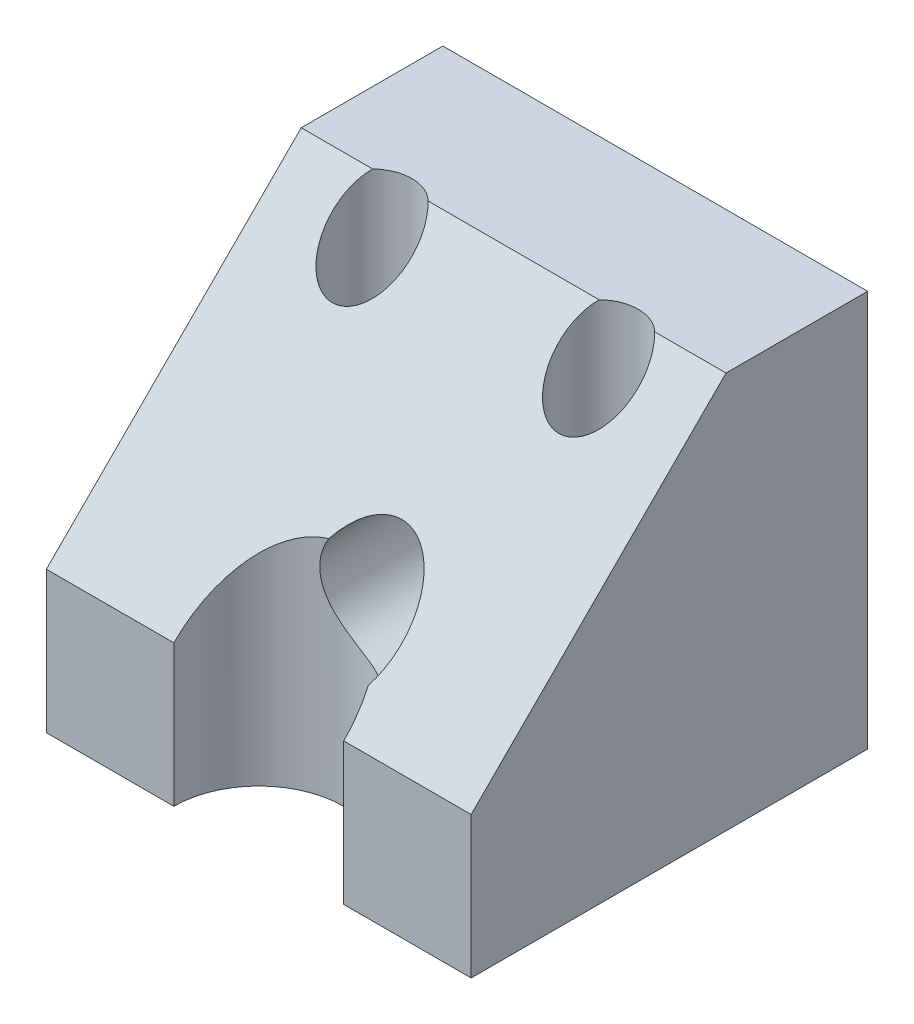
ISO-10303-21;
HEADER;
FILE_DESCRIPTION(('STEP AP214'),'2;1');
FILE_NAME('part.step','',(''),(''),'','','');
FILE_SCHEMA(('AUTOMOTIVE_DESIGN { 1 0 10303 214 1 1 1 1 }'));
ENDSEC;
DATA;
#1=APPLICATION_CONTEXT('core data for automotive mechanical design processes');
#2=APPLICATION_PROTOCOL_DEFINITION('international standard','automotive_design',2000,#1);
#3=PRODUCT_CONTEXT('',#1,'mechanical');
#4=PRODUCT('Part','Part','',(#3));
#5=PRODUCT_RELATED_PRODUCT_CATEGORY('part','',(#4));
#6=PRODUCT_DEFINITION_FORMATION('','',#4);
#7=PRODUCT_DEFINITION_CONTEXT('part definition',#1,'design');
#8=PRODUCT_DEFINITION('design','',#6,#7);
#9=PRODUCT_DEFINITION_SHAPE('','',#8);
#10=(LENGTH_UNIT() NAMED_UNIT(*) SI_UNIT(.MILLI.,.METRE.));
#11=(NAMED_UNIT(*) PLANE_ANGLE_UNIT() SI_UNIT($,.RADIAN.));
#12=(NAMED_UNIT(*) SI_UNIT($,.STERADIAN.) SOLID_ANGLE_UNIT());
#13=UNCERTAINTY_MEASURE_WITH_UNIT(LENGTH_MEASURE(1.E-05),#10,'distance_accuracy_value','');
#14=(GEOMETRIC_REPRESENTATION_CONTEXT(3) GLOBAL_UNCERTAINTY_ASSIGNED_CONTEXT((#13)) GLOBAL_UNIT_ASSIGNED_CONTEXT((#10,
#11,#12)) REPRESENTATION_CONTEXT('',''));
#15=CARTESIAN_POINT('',(0.,0.,0.));
#16=DIRECTION('',(0.,0.,1.));
#17=DIRECTION('',(1.,0.,0.));
#18=AXIS2_PLACEMENT_3D('',#15,#16,#17);
#19=CARTESIAN_POINT('',(15.,5.,14.));
#20=DIRECTION('',(0.,0.,-1.));
#21=DIRECTION('',(-1.,0.,0.));
#22=AXIS2_PLACEMENT_3D('',#19,#20,#21);
#23=PLANE('',#22);
#24=DIRECTION('',(-1.,0.,0.));
#25=VECTOR('',#24,1.);
#26=CARTESIAN_POINT('',(15.,5.,14.));
#27=LINE('',#26,#25);
#28=CARTESIAN_POINT('',(15.,5.,14.));
#29=VERTEX_POINT('',#28);
#30=CARTESIAN_POINT('',(10.5,5.,14.));
#31=VERTEX_POINT('',#30);
#32=EDGE_CURVE('E130',#29,#31,#27,.T.);
#33=ORIENTED_EDGE('',*,*,#32,.T.);
#34=DIRECTION('',(0.,-1.,0.));
#35=VECTOR('',#34,1.);
#36=CARTESIAN_POINT('',(10.5,14.,14.));
#37=LINE('',#36,#35);
#38=CARTESIAN_POINT('',(10.5,0.,14.));
#39=VERTEX_POINT('',#38);
#40=EDGE_CURVE('E117',#31,#39,#37,.T.);
#41=ORIENTED_EDGE('',*,*,#40,.T.);
#42=DIRECTION('',(-1.,0.,0.));
#43=VECTOR('',#42,1.);
#44=CARTESIAN_POINT('',(15.,0.,14.));
#45=LINE('',#44,#43);
#46=CARTESIAN_POINT('',(15.,0.,14.));
#47=VERTEX_POINT('',#46);
#48=EDGE_CURVE('E128',#47,#39,#45,.T.);
#49=ORIENTED_EDGE('',*,*,#48,.F.);
#50=DIRECTION('',(0.,-1.,0.));
#51=VECTOR('',#50,1.);
#52=CARTESIAN_POINT('',(15.,5.,14.));
#53=LINE('',#52,#51);
#54=EDGE_CURVE('E206',#29,#47,#53,.T.);
#55=ORIENTED_EDGE('',*,*,#54,.F.);
#56=EDGE_LOOP('',(#33,#41,#49,#55));
#57=FACE_BOUND('',#56,.T.);
#58=ADVANCED_FACE('F35',(#57),#23,.F.);
#59=CARTESIAN_POINT('',(4.5,0.,14.));
#60=VERTEX_POINT('',#59);
#61=CARTESIAN_POINT('',(0.,0.,14.));
#62=VERTEX_POINT('',#61);
#63=EDGE_CURVE('E138',#60,#62,#45,.T.);
#64=ORIENTED_EDGE('',*,*,#63,.F.);
#65=DIRECTION('',(0.,-1.,0.));
#66=VECTOR('',#65,1.);
#67=CARTESIAN_POINT('',(4.5,14.,14.));
#68=LINE('',#67,#66);
#69=CARTESIAN_POINT('',(4.5,5.,14.));
#70=VERTEX_POINT('',#69);
#71=EDGE_CURVE('E119',#60,#70,#68,.F.);
#72=ORIENTED_EDGE('',*,*,#71,.T.);
#73=CARTESIAN_POINT('',(0.,5.,14.));
#74=VERTEX_POINT('',#73);
#75=EDGE_CURVE('E209',#70,#74,#27,.T.);
#76=ORIENTED_EDGE('',*,*,#75,.T.);
#77=DIRECTION('',(0.,-1.,0.));
#78=VECTOR('',#77,1.);
#79=CARTESIAN_POINT('',(0.,5.,14.));
#80=LINE('',#79,#78);
#81=EDGE_CURVE('E185',#74,#62,#80,.T.);
#82=ORIENTED_EDGE('',*,*,#81,.T.);
#83=EDGE_LOOP('',(#64,#72,#76,#82));
#84=FACE_BOUND('',#83,.T.);
#85=ADVANCED_FACE('F37',(#84),#23,.F.);
#86=CARTESIAN_POINT('',(15.,0.,14.));
#87=DIRECTION('',(0.,1.,0.));
#88=DIRECTION('',(0.,0.,1.));
#89=AXIS2_PLACEMENT_3D('',#86,#87,#88);
#90=PLANE('',#89);
#91=CARTESIAN_POINT('',(3.5,0.,6.));
#92=DIRECTION('',(0.,1.,0.));
#93=DIRECTION('',(0.,0.,1.));
#94=AXIS2_PLACEMENT_3D('',#91,#92,#93);
#95=CIRCLE('',#94,1.4);
#96=CARTESIAN_POINT('',(3.5,0.,7.4));
#97=VERTEX_POINT('',#96);
#98=EDGE_CURVE('E240',#97,#97,#95,.T.);
#99=ORIENTED_EDGE('',*,*,#98,.T.);
#100=EDGE_LOOP('',(#99));
#101=FACE_BOUND('',#100,.T.);
#102=CARTESIAN_POINT('',(11.5,0.,6.));
#103=DIRECTION('',(0.,1.,0.));
#104=DIRECTION('',(0.,0.,1.));
#105=AXIS2_PLACEMENT_3D('',#102,#103,#104);
#106=CIRCLE('',#105,1.4);
#107=CARTESIAN_POINT('',(11.5,0.,7.4));
#108=VERTEX_POINT('',#107);
#109=EDGE_CURVE('E197',#108,#108,#106,.T.);
#110=ORIENTED_EDGE('',*,*,#109,.T.);
#111=EDGE_LOOP('',(#110));
#112=FACE_BOUND('',#111,.T.);
#113=ORIENTED_EDGE('',*,*,#48,.T.);
#114=CARTESIAN_POINT('',(7.5,0.,14.));
#115=DIRECTION('',(0.,-1.,0.));
#116=DIRECTION('',(0.,0.,-1.));
#117=AXIS2_PLACEMENT_3D('',#114,#115,#116);
#118=CIRCLE('',#117,3.);
#119=EDGE_CURVE('E114',#60,#39,#118,.T.);
#120=ORIENTED_EDGE('',*,*,#119,.F.);
#121=ORIENTED_EDGE('',*,*,#63,.T.);
#122=DIRECTION('',(0.,0.,-1.));
#123=VECTOR('',#122,1.);
#124=CARTESIAN_POINT('',(0.,0.,14.));
#125=LINE('',#124,#123);
#126=CARTESIAN_POINT('',(0.,0.,0.));
#127=VERTEX_POINT('',#126);
#128=EDGE_CURVE('E187',#62,#127,#125,.T.);
#129=ORIENTED_EDGE('',*,*,#128,.T.);
#130=DIRECTION('',(-1.,0.,0.));
#131=VECTOR('',#130,1.);
#132=CARTESIAN_POINT('',(15.,0.,0.));
#133=LINE('',#132,#131);
#134=CARTESIAN_POINT('',(15.,0.,0.));
#135=VERTEX_POINT('',#134);
#136=EDGE_CURVE('E142',#135,#127,#133,.T.);
#137=ORIENTED_EDGE('',*,*,#136,.F.);
#138=DIRECTION('',(0.,0.,-1.));
#139=VECTOR('',#138,1.);
#140=CARTESIAN_POINT('',(15.,0.,14.));
#141=LINE('',#140,#139);
#142=EDGE_CURVE('E135',#47,#135,#141,.T.);
#143=ORIENTED_EDGE('',*,*,#142,.F.);
#144=EDGE_LOOP('',(#113,#120,#121,#129,#137,#143));
#145=FACE_BOUND('',#144,.T.);
#146=ADVANCED_FACE('F133',(#101,#112,#145),#90,.F.);
#147=CARTESIAN_POINT('',(15.,0.,0.));
#148=DIRECTION('',(0.,0.,1.));
#149=DIRECTION('',(1.,0.,0.));
#150=AXIS2_PLACEMENT_3D('',#147,#148,#149);
#151=PLANE('',#150);
#152=CARTESIAN_POINT('',(8.65,7.,0.));
#153=DIRECTION('',(0.,0.,-1.));
#154=DIRECTION('',(-1.,0.,0.));
#155=AXIS2_PLACEMENT_3D('',#152,#153,#154);
#156=CIRCLE('',#155,1.9);
#157=CARTESIAN_POINT('',(6.75,7.,0.));
#158=VERTEX_POINT('',#157);
#159=EDGE_CURVE('E131',#158,#158,#156,.T.);
#160=ORIENTED_EDGE('',*,*,#159,.F.);
#161=EDGE_LOOP('',(#160));
#162=FACE_BOUND('',#161,.T.);
#163=DIRECTION('',(0.,1.,0.));
#164=VECTOR('',#163,1.);
#165=CARTESIAN_POINT('',(0.,0.,0.));
#166=LINE('',#165,#164);
#167=CARTESIAN_POINT('',(0.,14.,0.));
#168=VERTEX_POINT('',#167);
#169=EDGE_CURVE('E193',#127,#168,#166,.T.);
#170=ORIENTED_EDGE('',*,*,#169,.T.);
#171=DIRECTION('',(-1.,0.,0.));
#172=VECTOR('',#171,1.);
#173=CARTESIAN_POINT('',(15.,14.,0.));
#174=LINE('',#173,#172);
#175=CARTESIAN_POINT('',(15.,14.,0.));
#176=VERTEX_POINT('',#175);
#177=EDGE_CURVE('E212',#176,#168,#174,.T.);
#178=ORIENTED_EDGE('',*,*,#177,.F.);
#179=DIRECTION('',(0.,1.,0.));
#180=VECTOR('',#179,1.);
#181=CARTESIAN_POINT('',(15.,0.,0.));
#182=LINE('',#181,#180);
#183=EDGE_CURVE('E220',#135,#176,#182,.T.);
#184=ORIENTED_EDGE('',*,*,#183,.F.);
#185=ORIENTED_EDGE('',*,*,#136,.T.);
#186=EDGE_LOOP('',(#170,#178,#184,#185));
#187=FACE_BOUND('',#186,.T.);
#188=ADVANCED_FACE('F180',(#162,#187),#151,.F.);
#189=CARTESIAN_POINT('',(15.,14.,0.));
#190=DIRECTION('',(0.,-1.,0.));
#191=DIRECTION('',(0.,0.,-1.));
#192=AXIS2_PLACEMENT_3D('',#189,#190,#191);
#193=PLANE('',#192);
#194=DIRECTION('',(-1.,0.,0.));
#195=VECTOR('',#194,1.);
#196=CARTESIAN_POINT('',(15.,14.,5.00000000000004));
#197=LINE('',#196,#195);
#198=CARTESIAN_POINT('',(2.52020410288669,14.,5.00000000000004));
#199=VERTEX_POINT('',#198);
#200=CARTESIAN_POINT('',(0.,14.,5.00000000000004));
#201=VERTEX_POINT('',#200);
#202=EDGE_CURVE('E208',#199,#201,#197,.T.);
#203=ORIENTED_EDGE('',*,*,#202,.F.);
#204=CARTESIAN_POINT('',(3.5,14.,6.));
#205=DIRECTION('',(0.,-1.,0.));
#206=DIRECTION('',(0.,0.,-1.));
#207=AXIS2_PLACEMENT_3D('',#204,#205,#206);
#208=CIRCLE('',#207,1.4);
#209=CARTESIAN_POINT('',(4.47979589711331,14.,5.00000000000004));
#210=VERTEX_POINT('',#209);
#211=EDGE_CURVE('E61',#199,#210,#208,.T.);
#212=ORIENTED_EDGE('',*,*,#211,.T.);
#213=CARTESIAN_POINT('',(10.5202041028867,14.,5.00000000000004));
#214=VERTEX_POINT('',#213);
#215=EDGE_CURVE('E213',#214,#210,#197,.T.);
#216=ORIENTED_EDGE('',*,*,#215,.F.);
#217=CARTESIAN_POINT('',(11.5,14.,6.));
#218=DIRECTION('',(0.,-1.,0.));
#219=DIRECTION('',(0.,0.,-1.));
#220=AXIS2_PLACEMENT_3D('',#217,#218,#219);
#221=CIRCLE('',#220,1.4);
#222=CARTESIAN_POINT('',(12.4797958971133,14.,5.00000000000004));
#223=VERTEX_POINT('',#222);
#224=EDGE_CURVE('E238',#214,#223,#221,.T.);
#225=ORIENTED_EDGE('',*,*,#224,.T.);
#226=CARTESIAN_POINT('',(15.,14.,5.00000000000004));
#227=VERTEX_POINT('',#226);
#228=EDGE_CURVE('E210',#227,#223,#197,.T.);
#229=ORIENTED_EDGE('',*,*,#228,.F.);
#230=DIRECTION('',(0.,0.,1.));
#231=VECTOR('',#230,1.);
#232=CARTESIAN_POINT('',(15.,14.,0.));
#233=LINE('',#232,#231);
#234=EDGE_CURVE('E222',#176,#227,#233,.T.);
#235=ORIENTED_EDGE('',*,*,#234,.F.);
#236=ORIENTED_EDGE('',*,*,#177,.T.);
#237=DIRECTION('',(0.,0.,1.));
#238=VECTOR('',#237,1.);
#239=CARTESIAN_POINT('',(0.,14.,0.));
#240=LINE('',#239,#238);
#241=EDGE_CURVE('E195',#168,#201,#240,.T.);
#242=ORIENTED_EDGE('',*,*,#241,.T.);
#243=EDGE_LOOP('',(#203,#212,#216,#225,#229,#235,#236,#242));
#244=FACE_BOUND('',#243,.T.);
#245=ADVANCED_FACE('F233',(#244),#193,.F.);
#246=CARTESIAN_POINT('',(15.,14.,5.00000000000004));
#247=DIRECTION('',(0.,-0.707106781186546,-0.707106781186549));
#248=DIRECTION('',(0.,0.707106781186549,-0.707106781186546));
#249=AXIS2_PLACEMENT_3D('',#246,#247,#248);
#250=PLANE('',#249);
#251=ORIENTED_EDGE('',*,*,#75,.F.);
#252=CARTESIAN_POINT('',(7.5,5.,14.));
#253=DIRECTION('',(0.,-0.707106781186546,-0.707106781186549));
#254=DIRECTION('',(0.,-0.707106781186549,0.707106781186546));
#255=AXIS2_PLACEMENT_3D('',#252,#253,#254);
#256=ELLIPSE('',#255,4.24264068711929,3.);
#257=CARTESIAN_POINT('',(7.01021900340485,7.95974907304223,11.0402509269578));
#258=VERTEX_POINT('',#257);
#259=EDGE_CURVE('E253',#70,#258,#256,.T.);
#260=ORIENTED_EDGE('',*,*,#259,.T.);
#261=CARTESIAN_POINT('',(8.65,7.,12.));
#262=DIRECTION('',(0.,-0.707106781186546,-0.707106781186549));
#263=DIRECTION('',(0.,0.707106781186549,-0.707106781186546));
#264=AXIS2_PLACEMENT_3D('',#261,#262,#263);
#265=ELLIPSE('',#264,2.68700576850887,1.9);
#266=CARTESIAN_POINT('',(10.3043653084787,6.06561494762476,12.9343850523752));
#267=VERTEX_POINT('',#266);
#268=EDGE_CURVE('E151',#258,#267,#265,.T.);
#269=ORIENTED_EDGE('',*,*,#268,.T.);
#270=EDGE_CURVE('E55',#267,#31,#256,.T.);
#271=ORIENTED_EDGE('',*,*,#270,.T.);
#272=ORIENTED_EDGE('',*,*,#32,.F.);
#273=DIRECTION('',(0.,-0.707106781186549,0.707106781186546));
#274=VECTOR('',#273,1.);
#275=CARTESIAN_POINT('',(15.,14.,5.00000000000004));
#276=LINE('',#275,#274);
#277=EDGE_CURVE('E224',#227,#29,#276,.T.);
#278=ORIENTED_EDGE('',*,*,#277,.F.);
#279=ORIENTED_EDGE('',*,*,#228,.T.);
#280=CARTESIAN_POINT('',(11.5,13.,6.));
#281=DIRECTION('',(0.,-0.707106781186546,-0.707106781186549));
#282=DIRECTION('',(0.,-0.707106781186549,0.707106781186546));
#283=AXIS2_PLACEMENT_3D('',#280,#281,#282);
#284=ELLIPSE('',#283,1.97989898732234,1.4);
#285=EDGE_CURVE('E137',#223,#214,#284,.T.);
#286=ORIENTED_EDGE('',*,*,#285,.T.);
#287=ORIENTED_EDGE('',*,*,#215,.T.);
#288=CARTESIAN_POINT('',(3.5,13.,6.));
#289=DIRECTION('',(0.,-0.707106781186546,-0.707106781186549));
#290=DIRECTION('',(0.,-0.707106781186549,0.707106781186546));
#291=AXIS2_PLACEMENT_3D('',#288,#289,#290);
#292=ELLIPSE('',#291,1.97989898732234,1.4);
#293=EDGE_CURVE('E48',#210,#199,#292,.T.);
#294=ORIENTED_EDGE('',*,*,#293,.T.);
#295=ORIENTED_EDGE('',*,*,#202,.T.);
#296=DIRECTION('',(0.,-0.707106781186549,0.707106781186546));
#297=VECTOR('',#296,1.);
#298=CARTESIAN_POINT('',(0.,14.,5.00000000000004));
#299=LINE('',#298,#297);
#300=EDGE_CURVE('E203',#201,#74,#299,.T.);
#301=ORIENTED_EDGE('',*,*,#300,.T.);
#302=EDGE_LOOP('',(#251,#260,#269,#271,#272,#278,#279,#286,#287,#294,#295,#301));
#303=FACE_BOUND('',#302,.T.);
#304=ADVANCED_FACE('F231',(#303),#250,.F.);
#305=CARTESIAN_POINT('',(15.,0.,0.));
#306=DIRECTION('',(1.,0.,0.));
#307=DIRECTION('',(0.,0.,-1.));
#308=AXIS2_PLACEMENT_3D('',#305,#306,#307);
#309=PLANE('',#308);
#310=ORIENTED_EDGE('',*,*,#54,.T.);
#311=ORIENTED_EDGE('',*,*,#142,.T.);
#312=ORIENTED_EDGE('',*,*,#183,.T.);
#313=ORIENTED_EDGE('',*,*,#234,.T.);
#314=ORIENTED_EDGE('',*,*,#277,.T.);
#315=EDGE_LOOP('',(#310,#311,#312,#313,#314));
#316=FACE_BOUND('',#315,.T.);
#317=ADVANCED_FACE('F269',(#316),#309,.T.);
#318=CARTESIAN_POINT('',(0.,0.,0.));
#319=DIRECTION('',(1.,0.,0.));
#320=DIRECTION('',(0.,0.,-1.));
#321=AXIS2_PLACEMENT_3D('',#318,#319,#320);
#322=PLANE('',#321);
#323=ORIENTED_EDGE('',*,*,#81,.F.);
#324=ORIENTED_EDGE('',*,*,#300,.F.);
#325=ORIENTED_EDGE('',*,*,#241,.F.);
#326=ORIENTED_EDGE('',*,*,#169,.F.);
#327=ORIENTED_EDGE('',*,*,#128,.F.);
#328=EDGE_LOOP('',(#323,#324,#325,#326,#327));
#329=FACE_BOUND('',#328,.T.);
#330=ADVANCED_FACE('F168',(#329),#322,.F.);
#331=CARTESIAN_POINT('',(11.5,14.,6.));
#332=DIRECTION('',(0.,-1.,0.));
#333=DIRECTION('',(0.,0.,-1.));
#334=AXIS2_PLACEMENT_3D('',#331,#332,#333);
#335=CYLINDRICAL_SURFACE('',#334,1.4);
#336=CARTESIAN_POINT('',(10.1,8.22780291578086,6.));
#337=CARTESIAN_POINT('',(10.1000006261379,8.22780293299463,5.94769403627329));
#338=CARTESIAN_POINT('',(10.1029521152557,8.22434203738309,5.89538225364711));
#339=CARTESIAN_POINT('',(10.1145178510226,8.21048218725627,5.79232523663787));
#340=CARTESIAN_POINT('',(10.1231327541559,8.200082428409,5.74158018457903));
#341=CARTESIAN_POINT('',(10.1452934795097,8.1723521225977,5.64319241044657));
#342=CARTESIAN_POINT('',(10.1588362302078,8.15502589223418,5.59554777764411));
#343=CARTESIAN_POINT('',(10.1896800421642,8.11357467604412,5.50465555552102));
#344=CARTESIAN_POINT('',(10.2069805089393,8.08945076545371,5.46140727227036));
#345=CARTESIAN_POINT('',(10.2437253681816,8.03494387044842,5.38053421885084));
#346=CARTESIAN_POINT('',(10.2631561593972,8.00459962880053,5.34287701535966));
#347=CARTESIAN_POINT('',(10.302651107393,7.93820836571775,5.27339405598039));
#348=CARTESIAN_POINT('',(10.3227154008019,7.90216010726814,5.24156956825621));
#349=CARTESIAN_POINT('',(10.3634631936393,7.82231214064374,5.181649555582));
#350=CARTESIAN_POINT('',(10.384079345856,7.77813294539644,5.1540160034563));
#351=CARTESIAN_POINT('',(10.4228073271359,7.68533754230717,5.10522153618643));
#352=CARTESIAN_POINT('',(10.4409177677677,7.63671889910692,5.08406420174872));
#353=CARTESIAN_POINT('',(10.475857069044,7.52904046247975,5.04505735650586));
#354=CARTESIAN_POINT('',(10.4921382634751,7.46947863580732,5.02810490239202));
#355=CARTESIAN_POINT('',(10.5189814499641,7.34758347009422,5.00101833730363));
#356=CARTESIAN_POINT('',(10.5295399774365,7.2852484767912,4.99088835585446));
#357=CARTESIAN_POINT('',(10.5454859200758,7.14979874112037,4.97576989228112));
#358=CARTESIAN_POINT('',(10.5498762934442,7.07645439153695,4.97176467400321));
#359=CARTESIAN_POINT('',(10.5501187327985,6.9296947773853,4.97154354185673));
#360=CARTESIAN_POINT('',(10.5459638450453,6.85627950369362,4.97533397172687));
#361=CARTESIAN_POINT('',(10.5288008971303,6.70648692100985,4.99157221056953));
#362=CARTESIAN_POINT('',(10.5152298103124,6.63023134608836,5.00457176808361));
#363=CARTESIAN_POINT('',(10.4796918613551,6.4823263191408,5.04103295453408));
#364=CARTESIAN_POINT('',(10.4577355958376,6.41067118634841,5.06448138510461));
#365=CARTESIAN_POINT('',(10.413268309356,6.29002785701633,5.11687722441608));
#366=CARTESIAN_POINT('',(10.3919738471427,6.2395491568787,5.14343077485685));
#367=CARTESIAN_POINT('',(10.3473711212773,6.14462096355805,5.20446788347059));
#368=CARTESIAN_POINT('',(10.3240644208514,6.10016685789098,5.23894531989643));
#369=CARTESIAN_POINT('',(10.2775114705421,6.01845152340635,5.31621497037712));
#370=CARTESIAN_POINT('',(10.2542665310387,5.98123747251603,5.35905829914517));
#371=CARTESIAN_POINT('',(10.2105886224253,5.91550508946991,5.4522278517225));
#372=CARTESIAN_POINT('',(10.1901545860548,5.88698345189907,5.5025512202821));
#373=CARTESIAN_POINT('',(10.1565214700203,5.84194298762511,5.60307123164952));
#374=CARTESIAN_POINT('',(10.1427658777191,5.82443228081042,5.65264011045328));
#375=CARTESIAN_POINT('',(10.1206218326676,5.79684258125246,5.75494687648928));
#376=CARTESIAN_POINT('',(10.1122322103654,5.7867619689934,5.80768407042126));
#377=CARTESIAN_POINT('',(10.1018495030679,5.77435959654766,5.91183980258837));
#378=CARTESIAN_POINT('',(10.0995446613185,5.77165942025778,5.96318292876059));
#379=CARTESIAN_POINT('',(10.1006045715627,5.77291099839244,6.06572524142117));
#380=CARTESIAN_POINT('',(10.1039684596428,5.776861739218,6.11692444865165));
#381=CARTESIAN_POINT('',(10.1160527086539,5.7913742082501,6.2173177367348));
#382=CARTESIAN_POINT('',(10.1247316801734,5.80188486530898,6.26652420910961));
#383=CARTESIAN_POINT('',(10.1467155565819,5.82946544994806,6.36196590076857));
#384=CARTESIAN_POINT('',(10.16001992408,5.84653461556729,6.40820146448185));
#385=CARTESIAN_POINT('',(10.1902730549035,5.88725429084133,6.49681391193307));
#386=CARTESIAN_POINT('',(10.2072471554247,5.91095091095102,6.53916089487137));
#387=CARTESIAN_POINT('',(10.2433659510002,5.96451689275947,6.61869335648789));
#388=CARTESIAN_POINT('',(10.2625108335756,5.99438678791485,6.65587838863741));
#389=CARTESIAN_POINT('',(10.3022699330591,6.06108015366769,6.7260443191141));
#390=CARTESIAN_POINT('',(10.3229119897073,6.09814592463244,6.75877816290929));
#391=CARTESIAN_POINT('',(10.3632716497819,6.17739463443228,6.81800776513486));
#392=CARTESIAN_POINT('',(10.3829888436161,6.21957981136845,6.84450078020674));
#393=CARTESIAN_POINT('',(10.4222313256262,6.31295330788061,6.8941634647361));
#394=CARTESIAN_POINT('',(10.4414922432862,6.36462120211862,6.9166375535744));
#395=CARTESIAN_POINT('',(10.4759251322449,6.47163847428191,6.95495257634584));
#396=CARTESIAN_POINT('',(10.4910946879058,6.52699000317523,6.97078959463647));
#397=CARTESIAN_POINT('',(10.5185053465342,6.64902656939706,6.99855485259372));
#398=CARTESIAN_POINT('',(10.529914020931,6.71612759152024,7.00948049409789));
#399=CARTESIAN_POINT('',(10.545458758255,6.85194603563223,7.02418861782057));
#400=CARTESIAN_POINT('',(10.5495901475377,6.92066446767754,7.02796650970049));
#401=CARTESIAN_POINT('',(10.5503951310753,7.06616312168881,7.02871662236749));
#402=CARTESIAN_POINT('',(10.5461504293955,7.14295607836091,7.02485074088663));
#403=CARTESIAN_POINT('',(10.5285768934881,7.29457522055567,7.008207329323));
#404=CARTESIAN_POINT('',(10.5152427508655,7.36940023022659,6.99542459153581));
#405=CARTESIAN_POINT('',(10.4803945309165,7.51505731471245,6.95970459445573));
#406=CARTESIAN_POINT('',(10.4588408412127,7.58586811514482,6.93671807075793));
#407=CARTESIAN_POINT('',(10.4096679423644,7.72017368432909,6.87897608154546));
#408=CARTESIAN_POINT('',(10.3820624091072,7.78368446408375,6.84424705714594));
#409=CARTESIAN_POINT('',(10.3322716523908,7.8844343850129,6.77313522353085));
#410=CARTESIAN_POINT('',(10.3106624770636,7.92411369827152,6.73978875610534));
#411=CARTESIAN_POINT('',(10.2679854894418,7.99694526084713,6.66628888824049));
#412=CARTESIAN_POINT('',(10.2469173883332,8.03010105800228,6.62613920999007));
#413=CARTESIAN_POINT('',(10.2072325425131,8.08917671905403,6.53947111552734));
#414=CARTESIAN_POINT('',(10.1886259133848,8.11506718583815,6.49292792893478));
#415=CARTESIAN_POINT('',(10.1558343649172,8.15897362542007,6.39482698571233));
#416=CARTESIAN_POINT('',(10.1416485450519,8.17699120223944,6.34327025316102));
#417=CARTESIAN_POINT('',(10.1205002615378,8.2032775816905,6.24342793557016));
#418=CARTESIAN_POINT('',(10.1128611652085,8.21247685128836,6.19552705040594));
#419=CARTESIAN_POINT('',(10.1026109279896,8.22473928067693,6.09841909511864));
#420=CARTESIAN_POINT('',(10.0999994108975,8.22780289958527,6.04921212300648));
#421=CARTESIAN_POINT('',(10.1,8.22780291578086,6.));
#422=B_SPLINE_CURVE_WITH_KNOTS('',3,(#336,#337,#338,#339,#340,#341,#342,#343,#344,#345,#346,
#347,#348,#349,#350,#351,#352,#353,#354,#355,#356,#357,#358,#359,#360,#361,#362,#363,#364,#365,
#366,#367,#368,#369,#370,#371,#372,#373,#374,#375,#376,#377,#378,#379,#380,#381,#382,#383,#384,
#385,#386,#387,#388,#389,#390,#391,#392,#393,#394,#395,#396,#397,#398,#399,#400,#401,#402,#403,
#404,#405,#406,#407,#408,#409,#410,#411,#412,#413,#414,#415,#416,#417,#418,#419,#420,#421),
.UNSPECIFIED.,.T.,.F.,(4,2,2,2,2,2,2,2,2,2,2,2,2,2,2,2,2,2,2,2,2,2,2,2,2,2,2,2,2,2,2,2,2,2,2,2,
2,2,2,2,2,2,4),(0.,0.156732174949218,0.313482520974304,0.470135331559956,0.626763377182249,
0.782444005438489,0.938158442122321,1.10561158766552,1.2731571516578,1.46450729793381,
1.65597316132124,1.87578619980131,2.0957781827614,2.33020530786156,2.5643371549059,
2.74623531294474,2.92799341173926,3.11089889369738,3.29373473618527,3.45591817872851,
3.61806626016263,3.77172912247685,3.92536856870894,4.07782655009105,4.23026682441017,
4.38379527785182,4.53733700383369,4.69742952856358,4.85759229637263,5.03553780841656,
5.21358815488321,5.41956339427098,5.62567086766678,5.85562801935253,6.08571958529331,
6.3169343365277,6.54763188054368,6.7153877348153,6.88305210072182,7.05138540039761,
7.2196843878593,7.36715706103796,7.51461869873904),.UNSPECIFIED.);
#423=CARTESIAN_POINT('',(10.1,8.22780291578086,6.));
#424=VERTEX_POINT('',#423);
#425=EDGE_CURVE('E146',#424,#424,#422,.T.);
#426=ORIENTED_EDGE('',*,*,#425,.T.);
#427=EDGE_LOOP('',(#426));
#428=FACE_BOUND('',#427,.T.);
#429=ORIENTED_EDGE('',*,*,#224,.F.);
#430=ORIENTED_EDGE('',*,*,#285,.F.);
#431=EDGE_LOOP('',(#429,#430));
#432=FACE_BOUND('',#431,.T.);
#433=ORIENTED_EDGE('',*,*,#109,.F.);
#434=EDGE_LOOP('',(#433));
#435=FACE_BOUND('',#434,.T.);
#436=ADVANCED_FACE('F152',(#428,#432,#435),#335,.F.);
#437=CARTESIAN_POINT('',(3.5,14.,6.));
#438=DIRECTION('',(0.,-1.,0.));
#439=DIRECTION('',(0.,0.,-1.));
#440=AXIS2_PLACEMENT_3D('',#437,#438,#439);
#441=CYLINDRICAL_SURFACE('',#440,1.4);
#442=ORIENTED_EDGE('',*,*,#211,.F.);
#443=ORIENTED_EDGE('',*,*,#293,.F.);
#444=EDGE_LOOP('',(#442,#443));
#445=FACE_BOUND('',#444,.T.);
#446=ORIENTED_EDGE('',*,*,#98,.F.);
#447=EDGE_LOOP('',(#446));
#448=FACE_BOUND('',#447,.T.);
#449=ADVANCED_FACE('F159',(#445,#448),#441,.F.);
#450=CARTESIAN_POINT('',(8.65,7.,14.));
#451=DIRECTION('',(0.,0.,-1.));
#452=DIRECTION('',(-1.,0.,0.));
#453=AXIS2_PLACEMENT_3D('',#450,#451,#452);
#454=CYLINDRICAL_SURFACE('',#453,1.9);
#455=ORIENTED_EDGE('',*,*,#425,.F.);
#456=EDGE_LOOP('',(#455));
#457=FACE_BOUND('',#456,.T.);
#458=ORIENTED_EDGE('',*,*,#159,.T.);
#459=EDGE_LOOP('',(#458));
#460=FACE_BOUND('',#459,.T.);
#461=ORIENTED_EDGE('',*,*,#268,.F.);
#462=CARTESIAN_POINT('',(10.4999540729818,7.43320887324489,13.9834));
#463=CARTESIAN_POINT('',(10.4996726068151,7.43428551284989,13.9301235412732));
#464=CARTESIAN_POINT('',(10.49795304725,7.44182710047194,13.8777570163658));
#465=CARTESIAN_POINT('',(10.4920566244922,7.46582270832201,13.7761418180256));
#466=CARTESIAN_POINT('',(10.4879247883007,7.48211299217996,13.7268538738476));
#467=CARTESIAN_POINT('',(10.475761862675,7.52656736696724,13.6137862387994));
#468=CARTESIAN_POINT('',(10.4668694106924,7.55689291546681,13.5510283500572));
#469=CARTESIAN_POINT('',(10.4456826204647,7.62186402332436,13.4283206807857));
#470=CARTESIAN_POINT('',(10.4333807244009,7.65651908520731,13.3683774889703));
#471=CARTESIAN_POINT('',(10.4052218321184,7.72850529751364,13.2493339842895));
#472=CARTESIAN_POINT('',(10.389300172554,7.76587546126321,13.1902729182248));
#473=CARTESIAN_POINT('',(10.3540764017769,7.84134504569678,13.0737473759073));
#474=CARTESIAN_POINT('',(10.3347777056045,7.87944369535438,13.0162813540397));
#475=CARTESIAN_POINT('',(10.281734734446,7.97562004999485,12.8728419136865));
#476=CARTESIAN_POINT('',(10.2457188482794,8.03370955693518,12.7877034444881));
#477=CARTESIAN_POINT('',(10.1654360241003,8.14819680619802,12.6201154391962));
#478=CARTESIAN_POINT('',(10.1211632884948,8.20459332727848,12.5376678406033));
#479=CARTESIAN_POINT('',(10.0244360886907,8.31385153663433,12.3764274848186));
#480=CARTESIAN_POINT('',(9.97205021657249,8.3667379843679,12.2976106855738));
#481=CARTESIAN_POINT('',(9.85855493898183,8.46805258095802,12.1435617208288));
#482=CARTESIAN_POINT('',(9.79745256681374,8.51648427300987,12.068326729838));
#483=CARTESIAN_POINT('',(9.65244010439985,8.61692314750828,11.9068904313503));
#484=CARTESIAN_POINT('',(9.56643269473074,8.66755913944849,11.8216870957693));
#485=CARTESIAN_POINT('',(9.38103973015772,8.75674146476819,11.6597443816394));
#486=CARTESIAN_POINT('',(9.28166092548346,8.79529386577468,11.5830007677367));
#487=CARTESIAN_POINT('',(9.08936504078294,8.85070254545017,11.4534622272984));
#488=CARTESIAN_POINT('',(8.99845859837389,8.87020256546102,11.3988374022129));
#489=CARTESIAN_POINT('',(8.80980723183476,8.895652699213,11.2989325890626));
#490=CARTESIAN_POINT('',(8.71206683460019,8.9016116966661,11.2536464919845));
#491=CARTESIAN_POINT('',(8.51168241747488,8.89762325299873,11.1736575964102));
#492=CARTESIAN_POINT('',(8.40900648677719,8.8875532239546,11.1390388016068));
#493=CARTESIAN_POINT('',(8.20357486201672,8.8497527078046,11.0817241022098));
#494=CARTESIAN_POINT('',(8.10081925659697,8.82203315023733,11.0590208347415));
#495=CARTESIAN_POINT('',(7.9126102123402,8.75356655819016,11.0271718434408));
#496=CARTESIAN_POINT('',(7.82661289234178,8.71491227725628,11.016673925006));
#497=CARTESIAN_POINT('',(7.66087866623951,8.62496992868309,11.0031628677665));
#498=CARTESIAN_POINT('',(7.58114229800849,8.57368077715584,11.000150371348));
#499=CARTESIAN_POINT('',(7.4299151884736,8.45959177492144,10.9998598014823));
#500=CARTESIAN_POINT('',(7.35845903322159,8.39674629269448,11.0026049263244));
#501=CARTESIAN_POINT('',(7.22583137515039,8.26124569742718,11.0118136030097));
#502=CARTESIAN_POINT('',(7.16466361995071,8.18858702716702,11.018278506033));
#503=CARTESIAN_POINT('',(7.04900933082764,8.02831489755127,11.033468368395));
#504=CARTESIAN_POINT('',(6.99558414860292,7.93994812015357,11.0423421305401));
#505=CARTESIAN_POINT('',(6.90370266933127,7.75567856488242,11.059486076875));
#506=CARTESIAN_POINT('',(6.86524947177691,7.6597742315216,11.0677561357988));
#507=CARTESIAN_POINT('',(6.80313372700378,7.4588747455598,11.08187641704));
#508=CARTESIAN_POINT('',(6.78011973540613,7.35366977851873,11.087617406261));
#509=CARTESIAN_POINT('',(6.75218258477284,7.14075331548773,11.0946628070388));
#510=CARTESIAN_POINT('',(6.74725455939201,7.03304250159035,11.095968412006));
#511=CARTESIAN_POINT('',(6.75552903720073,6.8215029388344,11.0938385253225));
#512=CARTESIAN_POINT('',(6.76821150896132,6.71765198244945,11.0905390066856));
#513=CARTESIAN_POINT('',(6.81036064235232,6.51359918430246,11.0802635469918));
#514=CARTESIAN_POINT('',(6.83983053597899,6.41339804917523,11.0732868980152));
#515=CARTESIAN_POINT('',(6.91486654600407,6.2188199789827,11.0573672625879));
#516=CARTESIAN_POINT('',(6.96051225878159,6.12447460602586,11.0484146366286));
#517=CARTESIAN_POINT('',(7.06670363070725,5.94449350211609,11.0309695955813));
#518=CARTESIAN_POINT('',(7.12725356958981,5.85886028284956,11.0224773135368));
#519=CARTESIAN_POINT('',(7.26348673486673,5.69650994421251,11.0085357468198));
#520=CARTESIAN_POINT('',(7.33951346116361,5.62007254057296,11.0031687089607));
#521=CARTESIAN_POINT('',(7.50351075264774,5.48108803495138,10.9988850887736));
#522=CARTESIAN_POINT('',(7.59147379745375,5.41853225184531,10.9999644632067));
#523=CARTESIAN_POINT('',(7.77097170162211,5.31253507650171,11.0109903114254));
#524=CARTESIAN_POINT('',(7.86200866164904,5.26819996025285,11.0204222476044));
#525=CARTESIAN_POINT('',(8.04859422072201,5.19491218967581,11.0490800990334));
#526=CARTESIAN_POINT('',(8.14414018131927,5.16595065807545,11.0683003495597));
#527=CARTESIAN_POINT('',(8.32845333497289,5.12521462341311,11.1152122260965));
#528=CARTESIAN_POINT('',(8.41716622322618,5.11227301862565,11.1421236883224));
#529=CARTESIAN_POINT('',(8.59249503355721,5.09883487143762,11.2044471191762));
#530=CARTESIAN_POINT('',(8.67911058552899,5.09834050977663,11.2398605762446));
#531=CARTESIAN_POINT('',(8.85132685182051,5.10865148770981,11.3198361584228));
#532=CARTESIAN_POINT('',(8.93676001490391,5.11989273736901,11.3646980942674));
#533=CARTESIAN_POINT('',(9.10146602396518,5.15250450377236,11.4614075736832));
#534=CARTESIAN_POINT('',(9.18073577752245,5.17388006760366,11.513258588734));
#535=CARTESIAN_POINT('',(9.3717402174354,5.23821859905262,11.6512203240568));
#536=CARTESIAN_POINT('',(9.47891031816376,5.28662691105833,11.741120928466));
#537=CARTESIAN_POINT('',(9.67642323312098,5.3970893753289,11.9306919705128));
#538=CARTESIAN_POINT('',(9.76671828231606,5.4591812093792,12.0303889569782));
#539=CARTESIAN_POINT('',(9.90646070291572,5.57282183807117,12.206245183415));
#540=CARTESIAN_POINT('',(9.96009187795803,5.62205984439439,12.2806483327792));
#541=CARTESIAN_POINT('',(10.05947866991,5.7238987019783,12.4324212571684));
#542=CARTESIAN_POINT('',(10.1052301436717,5.77650130253052,12.5097925668696));
#543=CARTESIAN_POINT('',(10.1890838207852,5.88382267522454,12.6670461474336));
#544=CARTESIAN_POINT('',(10.2271913282705,5.93853994833551,12.7469266323577));
#545=CARTESIAN_POINT('',(10.2960411403433,6.04880696247557,12.9091657125528));
#546=CARTESIAN_POINT('',(10.3267871850052,6.10435626547389,12.9915230254002));
#547=CARTESIAN_POINT('',(10.378644358346,6.209502839565,13.1515675803075));
#548=CARTESIAN_POINT('',(10.4003779307076,6.25918145898756,13.2289970963306));
#549=CARTESIAN_POINT('',(10.4285451095269,6.33108474105794,13.3478657304825));
#550=CARTESIAN_POINT('',(10.4372007407878,6.35463552027884,13.3879777201312));
#551=CARTESIAN_POINT('',(10.4529901175302,6.40016184488422,13.4693711287982));
#552=CARTESIAN_POINT('',(10.4601244695991,6.42213801579071,13.5106520742469));
#553=CARTESIAN_POINT('',(10.4740737634211,6.46762822551999,13.6031384073782));
#554=CARTESIAN_POINT('',(10.4805417072769,6.49057594969484,13.6546821207022));
#555=CARTESIAN_POINT('',(10.490885426129,6.52931044281095,13.7604601251525));
#556=CARTESIAN_POINT('',(10.4947812745095,6.54515234816794,13.8146699453988));
#557=CARTESIAN_POINT('',(10.4979915567872,6.55848055768663,13.8886577325672));
#558=CARTESIAN_POINT('',(10.4986311002331,6.56117358612253,13.9074431393362));
#559=CARTESIAN_POINT('',(10.4995609560193,6.56511278614048,13.9452745607573));
#560=CARTESIAN_POINT('',(10.4998493680903,6.56635108368752,13.9643214342216));
#561=CARTESIAN_POINT('',(10.4999540729818,6.56679112675511,13.9834));
#562=B_SPLINE_CURVE_WITH_KNOTS('',3,(#462,#463,#464,#465,#466,#467,#468,#469,#470,#471,#472,
#473,#474,#475,#476,#477,#478,#479,#480,#481,#482,#483,#484,#485,#486,#487,#488,#489,#490,#491,
#492,#493,#494,#495,#496,#497,#498,#499,#500,#501,#502,#503,#504,#505,#506,#507,#508,#509,#510,
#511,#512,#513,#514,#515,#516,#517,#518,#519,#520,#521,#522,#523,#524,#525,#526,#527,#528,#529,
#530,#531,#532,#533,#534,#535,#536,#537,#538,#539,#540,#541,#542,#543,#544,#545,#546,#547,#548,
#549,#550,#551,#552,#553,#554,#555,#556,#557,#558,#559,#560,#561),.UNSPECIFIED.,.F.,.F.,(4,2,2,
2,2,2,2,2,2,2,2,2,2,2,2,2,2,2,2,2,2,2,2,2,2,2,2,2,2,2,2,2,2,2,2,2,2,2,2,2,2,2,2,2,2,2,2,2,2,4),
(0.,0.158355475300787,0.313845567454207,0.524190467002005,0.735005426256405,0.949932421258087,
1.16464331353342,1.49182231695066,1.81923192180748,2.1440110265152,2.46852953537473,
2.860929294882,3.25313169881922,3.5753581094595,3.8973730594007,4.22186259378031,
4.54615138193586,4.82939818275806,5.1126692904988,5.39708393065423,5.68160194746073,
5.99115300173694,6.30076810508366,6.62268813299935,6.94452153635449,7.25705079674138,
7.56964024712991,7.88378971729975,8.19802950064204,8.5202035461023,8.84217554278462,
9.14559437611942,9.44883781316508,9.72836323357296,10.0079376261028,10.2982790553471,
10.5887652324481,11.0303728383033,11.4732120904794,11.7851181751243,12.0971877626459,
12.409040050837,12.720733561135,13.0040417819034,13.14593591055,13.2877733547889,
13.4578771838433,13.6266372667897,13.6835458255203,13.7407610149),.UNSPECIFIED.);
#563=EDGE_CURVE('E11',#258,#267,#562,.T.);
#564=ORIENTED_EDGE('',*,*,#563,.T.);
#565=EDGE_LOOP('',(#461,#564));
#566=FACE_BOUND('',#565,.T.);
#567=ADVANCED_FACE('F156',(#457,#460,#566),#454,.F.);
#568=CARTESIAN_POINT('',(7.5,14.,14.));
#569=DIRECTION('',(0.,-1.,0.));
#570=DIRECTION('',(0.,0.,-1.));
#571=AXIS2_PLACEMENT_3D('',#568,#569,#570);
#572=CYLINDRICAL_SURFACE('',#571,3.);
#573=ORIENTED_EDGE('',*,*,#270,.F.);
#574=ORIENTED_EDGE('',*,*,#563,.F.);
#575=ORIENTED_EDGE('',*,*,#259,.F.);
#576=ORIENTED_EDGE('',*,*,#71,.F.);
#577=ORIENTED_EDGE('',*,*,#119,.T.);
#578=ORIENTED_EDGE('',*,*,#40,.F.);
#579=EDGE_LOOP('',(#573,#574,#575,#576,#577,#578));
#580=FACE_BOUND('',#579,.T.);
#581=ADVANCED_FACE('F116',(#580),#572,.F.);
#582=CLOSED_SHELL('',(#58,#85,#146,#188,#245,#304,#317,#330,#436,#449,#567,#581));
#583=MANIFOLD_SOLID_BREP('B2',#582);
#584=ADVANCED_BREP_SHAPE_REPRESENTATION('',(#18,#583),#14);
#585=SHAPE_DEFINITION_REPRESENTATION(#9,#584);
ENDSEC;
END-ISO-10303-21;
